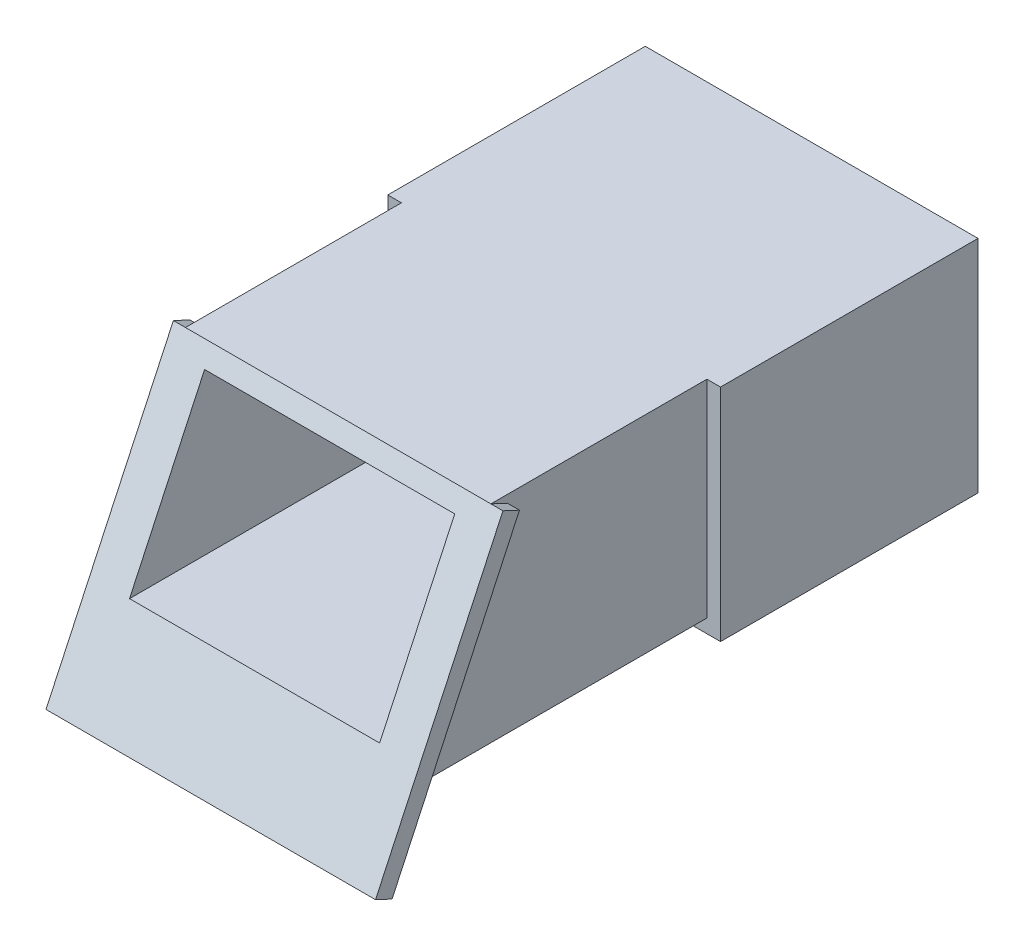
ISO-10303-21;
HEADER;
FILE_DESCRIPTION(('STEP AP214'),'2;1');
FILE_NAME('part.step','',(''),(''),'','','');
FILE_SCHEMA(('AUTOMOTIVE_DESIGN { 1 0 10303 214 1 1 1 1 }'));
ENDSEC;
DATA;
#1=APPLICATION_CONTEXT('core data for automotive mechanical design processes');
#2=APPLICATION_PROTOCOL_DEFINITION('international standard','automotive_design',2000,#1);
#3=PRODUCT_CONTEXT('',#1,'mechanical');
#4=PRODUCT('Part','Part','',(#3));
#5=PRODUCT_RELATED_PRODUCT_CATEGORY('part','',(#4));
#6=PRODUCT_DEFINITION_FORMATION('','',#4);
#7=PRODUCT_DEFINITION_CONTEXT('part definition',#1,'design');
#8=PRODUCT_DEFINITION('design','',#6,#7);
#9=PRODUCT_DEFINITION_SHAPE('','',#8);
#10=(LENGTH_UNIT() NAMED_UNIT(*) SI_UNIT(.MILLI.,.METRE.));
#11=(NAMED_UNIT(*) PLANE_ANGLE_UNIT() SI_UNIT($,.RADIAN.));
#12=(NAMED_UNIT(*) SI_UNIT($,.STERADIAN.) SOLID_ANGLE_UNIT());
#13=UNCERTAINTY_MEASURE_WITH_UNIT(LENGTH_MEASURE(1.E-05),#10,'distance_accuracy_value','');
#14=(GEOMETRIC_REPRESENTATION_CONTEXT(3) GLOBAL_UNCERTAINTY_ASSIGNED_CONTEXT((#13)) GLOBAL_UNIT_ASSIGNED_CONTEXT((#10,
#11,#12)) REPRESENTATION_CONTEXT('',''));
#15=CARTESIAN_POINT('',(0.,0.,0.));
#16=DIRECTION('',(0.,0.,1.));
#17=DIRECTION('',(1.,0.,0.));
#18=AXIS2_PLACEMENT_3D('',#15,#16,#17);
#19=CARTESIAN_POINT('',(0.,32.2321446955881,69.0956443006175));
#20=DIRECTION('',(0.,0.422750947184347,0.906245902972663));
#21=DIRECTION('',(0.,-0.906245902972663,0.422750947184347));
#22=AXIS2_PLACEMENT_3D('',#19,#20,#21);
#23=PLANE('',#22);
#24=DIRECTION('',(1.,0.,0.));
#25=VECTOR('',#24,1.);
#26=CARTESIAN_POINT('',(-36.8768135180335,17.9473146346855,75.7593162894288));
#27=LINE('',#26,#25);
#28=CARTESIAN_POINT('',(13.9281864819665,17.9473146346855,75.7593162894288));
#29=VERTEX_POINT('',#28);
#30=CARTESIAN_POINT('',(15.8531864819665,17.9473146346855,75.7593162894288));
#31=VERTEX_POINT('',#30);
#32=EDGE_CURVE('E226',#29,#31,#27,.T.);
#33=ORIENTED_EDGE('',*,*,#32,.F.);
#34=DIRECTION('',(-1.,0.,0.));
#35=VECTOR('',#34,1.);
#36=CARTESIAN_POINT('',(-37.1318135180335,17.9473146346855,75.7593162894288));
#37=LINE('',#36,#35);
#38=CARTESIAN_POINT('',(-34.9518135180335,17.9473146346855,75.7593162894288));
#39=VERTEX_POINT('',#38);
#40=EDGE_CURVE('E270',#29,#39,#37,.T.);
#41=ORIENTED_EDGE('',*,*,#40,.T.);
#42=CARTESIAN_POINT('',(-36.8768135180335,17.9473146346855,75.7593162894288));
#43=VERTEX_POINT('',#42);
#44=EDGE_CURVE('E244',#43,#39,#27,.T.);
#45=ORIENTED_EDGE('',*,*,#44,.F.);
#46=DIRECTION('',(0.,0.906245902972663,-0.422750947184347));
#47=VECTOR('',#46,1.);
#48=CARTESIAN_POINT('',(-36.8768135180335,17.9473146346855,75.7593162894288));
#49=LINE('',#48,#47);
#50=CARTESIAN_POINT('',(-36.8768135180335,-25.7518628066563,96.144366962658));
#51=VERTEX_POINT('',#50);
#52=EDGE_CURVE('E223',#51,#43,#49,.T.);
#53=ORIENTED_EDGE('',*,*,#52,.F.);
#54=DIRECTION('',(-1.,0.,0.));
#55=VECTOR('',#54,1.);
#56=CARTESIAN_POINT('',(-36.8768135180335,-25.7518628066563,96.144366962658));
#57=LINE('',#56,#55);
#58=CARTESIAN_POINT('',(15.8531864819665,-25.7518628066563,96.144366962658));
#59=VERTEX_POINT('',#58);
#60=EDGE_CURVE('E235',#59,#51,#57,.T.);
#61=ORIENTED_EDGE('',*,*,#60,.F.);
#62=DIRECTION('',(0.,-0.906245902972663,0.422750947184347));
#63=VECTOR('',#62,1.);
#64=CARTESIAN_POINT('',(15.8531864819665,17.9473146346855,75.7593162894288));
#65=LINE('',#64,#63);
#66=EDGE_CURVE('E246',#31,#59,#65,.T.);
#67=ORIENTED_EDGE('',*,*,#66,.F.);
#68=EDGE_LOOP('',(#33,#41,#45,#53,#61,#67));
#69=FACE_BOUND('',#68,.T.);
#70=DIRECTION('',(1.,0.,0.));
#71=VECTOR('',#70,1.);
#72=CARTESIAN_POINT('',(0.,15.0273146346855,77.1214551545306));
#73=LINE('',#72,#71);
#74=CARTESIAN_POINT('',(-30.5218135180335,15.0273146346855,77.1214551545306));
#75=VERTEX_POINT('',#74);
#76=CARTESIAN_POINT('',(9.49818648196652,15.0273146346855,77.1214551545306));
#77=VERTEX_POINT('',#76);
#78=EDGE_CURVE('E222',#75,#77,#73,.T.);
#79=ORIENTED_EDGE('',*,*,#78,.T.);
#80=DIRECTION('',(0.,-0.906245902972663,0.422750947184347));
#81=VECTOR('',#80,1.);
#82=CARTESIAN_POINT('',(9.49818648196652,32.2321446955881,69.0956443006175));
#83=LINE('',#82,#81);
#84=CARTESIAN_POINT('',(9.49818648196652,-10.7226853653145,89.1334674067121));
#85=VERTEX_POINT('',#84);
#86=EDGE_CURVE('E207',#77,#85,#83,.T.);
#87=ORIENTED_EDGE('',*,*,#86,.T.);
#88=DIRECTION('',(-1.,0.,0.));
#89=VECTOR('',#88,1.);
#90=CARTESIAN_POINT('',(0.,-10.7226853653145,89.1334674067121));
#91=LINE('',#90,#89);
#92=CARTESIAN_POINT('',(-30.5218135180335,-10.7226853653145,89.1334674067121));
#93=VERTEX_POINT('',#92);
#94=EDGE_CURVE('E215',#85,#93,#91,.T.);
#95=ORIENTED_EDGE('',*,*,#94,.T.);
#96=DIRECTION('',(0.,0.906245902972663,-0.422750947184347));
#97=VECTOR('',#96,1.);
#98=CARTESIAN_POINT('',(-30.5218135180335,32.2321446955881,69.0956443006175));
#99=LINE('',#98,#97);
#100=EDGE_CURVE('E219',#93,#75,#99,.T.);
#101=ORIENTED_EDGE('',*,*,#100,.T.);
#102=EDGE_LOOP('',(#79,#87,#95,#101));
#103=FACE_BOUND('',#102,.T.);
#104=ADVANCED_FACE('F59',(#69,#103),#23,.T.);
#105=CARTESIAN_POINT('',(-33.9518135180335,15.0273146346855,41.2));
#106=DIRECTION('',(0.,-1.,0.));
#107=DIRECTION('',(0.,0.,-1.));
#108=AXIS2_PLACEMENT_3D('',#105,#106,#107);
#109=PLANE('',#108);
#110=DIRECTION('',(-1.,0.,0.));
#111=VECTOR('',#110,1.);
#112=CARTESIAN_POINT('',(-33.9518135180335,15.0273146346855,41.2));
#113=LINE('',#112,#111);
#114=CARTESIAN_POINT('',(12.9281864819665,15.0273146346855,41.2));
#115=VERTEX_POINT('',#114);
#116=CARTESIAN_POINT('',(9.49818648196652,15.0273146346855,41.2));
#117=VERTEX_POINT('',#116);
#118=EDGE_CURVE('E310',#115,#117,#113,.T.);
#119=ORIENTED_EDGE('',*,*,#118,.T.);
#120=DIRECTION('',(0.,0.,-1.));
#121=VECTOR('',#120,1.);
#122=CARTESIAN_POINT('',(9.49818648196652,15.0273146346855,91.2));
#123=LINE('',#122,#121);
#124=EDGE_CURVE('E212',#77,#117,#123,.T.);
#125=ORIENTED_EDGE('',*,*,#124,.F.);
#126=ORIENTED_EDGE('',*,*,#78,.F.);
#127=DIRECTION('',(0.,0.,-1.));
#128=VECTOR('',#127,1.);
#129=CARTESIAN_POINT('',(-30.5218135180335,15.0273146346855,91.2));
#130=LINE('',#129,#128);
#131=CARTESIAN_POINT('',(-30.5218135180335,15.0273146346855,41.2));
#132=VERTEX_POINT('',#131);
#133=EDGE_CURVE('E281',#75,#132,#130,.T.);
#134=ORIENTED_EDGE('',*,*,#133,.T.);
#135=CARTESIAN_POINT('',(-33.9518135180335,15.0273146346855,41.2));
#136=VERTEX_POINT('',#135);
#137=EDGE_CURVE('E309',#132,#136,#113,.T.);
#138=ORIENTED_EDGE('',*,*,#137,.T.);
#139=DIRECTION('',(0.,0.,-1.));
#140=VECTOR('',#139,1.);
#141=CARTESIAN_POINT('',(-33.9518135180335,15.0273146346855,41.2));
#142=LINE('',#141,#140);
#143=CARTESIAN_POINT('',(-33.9518135180335,15.0273146346855,0.));
#144=VERTEX_POINT('',#143);
#145=EDGE_CURVE('E313',#136,#144,#142,.T.);
#146=ORIENTED_EDGE('',*,*,#145,.T.);
#147=DIRECTION('',(-1.,0.,0.));
#148=VECTOR('',#147,1.);
#149=CARTESIAN_POINT('',(-33.9518135180335,15.0273146346855,0.));
#150=LINE('',#149,#148);
#151=CARTESIAN_POINT('',(12.9281864819665,15.0273146346855,0.));
#152=VERTEX_POINT('',#151);
#153=EDGE_CURVE('E303',#152,#144,#150,.T.);
#154=ORIENTED_EDGE('',*,*,#153,.F.);
#155=DIRECTION('',(0.,0.,-1.));
#156=VECTOR('',#155,1.);
#157=CARTESIAN_POINT('',(12.9281864819665,15.0273146346855,41.2));
#158=LINE('',#157,#156);
#159=EDGE_CURVE('E326',#115,#152,#158,.T.);
#160=ORIENTED_EDGE('',*,*,#159,.F.);
#161=EDGE_LOOP('',(#119,#125,#126,#134,#138,#146,#154,#160));
#162=FACE_BOUND('',#161,.T.);
#163=ADVANCED_FACE('F436',(#162),#109,.T.);
#164=CARTESIAN_POINT('',(13.9281864819665,-15.1526853653145,91.2));
#165=DIRECTION('',(-1.,0.,0.));
#166=DIRECTION('',(0.,0.,1.));
#167=AXIS2_PLACEMENT_3D('',#164,#165,#166);
#168=PLANE('',#167);
#169=DIRECTION('',(0.,0.422750947184347,0.906245902972663));
#170=VECTOR('',#169,1.);
#171=CARTESIAN_POINT('',(13.9281864819665,17.9473146346855,75.7593162894288));
#172=LINE('',#171,#170);
#173=CARTESIAN_POINT('',(13.9281864819665,16.7128818689072,73.1130782527486));
#174=VERTEX_POINT('',#173);
#175=EDGE_CURVE('E263',#174,#29,#172,.T.);
#176=ORIENTED_EDGE('',*,*,#175,.F.);
#177=DIRECTION('',(0.,0.906245902972663,-0.422750947184347));
#178=VECTOR('',#177,1.);
#179=CARTESIAN_POINT('',(13.9281864819665,-16.3871181310928,88.5537619633198));
#180=LINE('',#179,#178);
#181=CARTESIAN_POINT('',(13.9281864819665,-15.1526853653145,87.9779164679015));
#182=VERTEX_POINT('',#181);
#183=EDGE_CURVE('E268',#182,#174,#180,.T.);
#184=ORIENTED_EDGE('',*,*,#183,.F.);
#185=DIRECTION('',(0.,0.,-1.));
#186=VECTOR('',#185,1.);
#187=CARTESIAN_POINT('',(13.9281864819665,-15.1526853653145,91.2));
#188=LINE('',#187,#186);
#189=CARTESIAN_POINT('',(13.9281864819665,-15.1526853653145,41.2));
#190=VERTEX_POINT('',#189);
#191=EDGE_CURVE('E296',#182,#190,#188,.T.);
#192=ORIENTED_EDGE('',*,*,#191,.T.);
#193=DIRECTION('',(0.,1.,0.));
#194=VECTOR('',#193,1.);
#195=CARTESIAN_POINT('',(13.9281864819665,-15.1526853653145,41.2));
#196=LINE('',#195,#194);
#197=CARTESIAN_POINT('',(13.9281864819665,17.9473146346855,41.2));
#198=VERTEX_POINT('',#197);
#199=EDGE_CURVE('E285',#190,#198,#196,.T.);
#200=ORIENTED_EDGE('',*,*,#199,.T.);
#201=DIRECTION('',(0.,0.,-1.));
#202=VECTOR('',#201,1.);
#203=CARTESIAN_POINT('',(13.9281864819665,17.9473146346855,91.2));
#204=LINE('',#203,#202);
#205=EDGE_CURVE('E294',#29,#198,#204,.T.);
#206=ORIENTED_EDGE('',*,*,#205,.F.);
#207=EDGE_LOOP('',(#176,#184,#192,#200,#206));
#208=FACE_BOUND('',#207,.T.);
#209=ADVANCED_FACE('F389',(#208),#168,.F.);
#210=CARTESIAN_POINT('',(-34.9518135180335,-15.1526853653145,91.2));
#211=DIRECTION('',(-1.,0.,0.));
#212=DIRECTION('',(0.,0.,1.));
#213=AXIS2_PLACEMENT_3D('',#210,#211,#212);
#214=PLANE('',#213);
#215=DIRECTION('',(0.,0.906245902972663,-0.422750947184347));
#216=VECTOR('',#215,1.);
#217=CARTESIAN_POINT('',(-34.9518135180335,-16.3871181310928,88.5537619633198));
#218=LINE('',#217,#216);
#219=CARTESIAN_POINT('',(-34.9518135180335,-15.1526853653145,87.9779164679015));
#220=VERTEX_POINT('',#219);
#221=CARTESIAN_POINT('',(-34.9518135180335,16.7128818689072,73.1130782527486));
#222=VERTEX_POINT('',#221);
#223=EDGE_CURVE('E265',#220,#222,#218,.T.);
#224=ORIENTED_EDGE('',*,*,#223,.T.);
#225=DIRECTION('',(0.,0.422750947184347,0.906245902972663));
#226=VECTOR('',#225,1.);
#227=CARTESIAN_POINT('',(-34.9518135180335,17.9473146346855,75.7593162894288));
#228=LINE('',#227,#226);
#229=EDGE_CURVE('E260',#222,#39,#228,.T.);
#230=ORIENTED_EDGE('',*,*,#229,.T.);
#231=DIRECTION('',(0.,0.,-1.));
#232=VECTOR('',#231,1.);
#233=CARTESIAN_POINT('',(-34.9518135180335,17.9473146346855,91.2));
#234=LINE('',#233,#232);
#235=CARTESIAN_POINT('',(-34.9518135180335,17.9473146346855,41.2));
#236=VERTEX_POINT('',#235);
#237=EDGE_CURVE('E292',#39,#236,#234,.T.);
#238=ORIENTED_EDGE('',*,*,#237,.T.);
#239=DIRECTION('',(0.,1.,0.));
#240=VECTOR('',#239,1.);
#241=CARTESIAN_POINT('',(-34.9518135180335,-15.1526853653145,41.2));
#242=LINE('',#241,#240);
#243=CARTESIAN_POINT('',(-34.9518135180335,-15.1526853653145,41.2));
#244=VERTEX_POINT('',#243);
#245=EDGE_CURVE('E288',#244,#236,#242,.T.);
#246=ORIENTED_EDGE('',*,*,#245,.F.);
#247=DIRECTION('',(0.,0.,-1.));
#248=VECTOR('',#247,1.);
#249=CARTESIAN_POINT('',(-34.9518135180335,-15.1526853653145,91.2));
#250=LINE('',#249,#248);
#251=EDGE_CURVE('E82',#220,#244,#250,.T.);
#252=ORIENTED_EDGE('',*,*,#251,.F.);
#253=EDGE_LOOP('',(#224,#230,#238,#246,#252));
#254=FACE_BOUND('',#253,.T.);
#255=ADVANCED_FACE('F396',(#254),#214,.T.);
#256=CARTESIAN_POINT('',(-30.5218135180335,15.0273146346855,91.2));
#257=DIRECTION('',(1.,0.,0.));
#258=DIRECTION('',(0.,1.,0.));
#259=AXIS2_PLACEMENT_3D('',#256,#257,#258);
#260=PLANE('',#259);
#261=ORIENTED_EDGE('',*,*,#133,.F.);
#262=ORIENTED_EDGE('',*,*,#100,.F.);
#263=DIRECTION('',(0.,0.,-1.));
#264=VECTOR('',#263,1.);
#265=CARTESIAN_POINT('',(-30.5218135180335,-10.7226853653145,91.2));
#266=LINE('',#265,#264);
#267=CARTESIAN_POINT('',(-30.5218135180335,-10.7226853653145,41.2));
#268=VERTEX_POINT('',#267);
#269=EDGE_CURVE('E74',#93,#268,#266,.T.);
#270=ORIENTED_EDGE('',*,*,#269,.T.);
#271=DIRECTION('',(0.,-1.,0.));
#272=VECTOR('',#271,1.);
#273=CARTESIAN_POINT('',(-30.5218135180335,15.0273146346855,41.2));
#274=LINE('',#273,#272);
#275=EDGE_CURVE('E273',#132,#268,#274,.T.);
#276=ORIENTED_EDGE('',*,*,#275,.F.);
#277=EDGE_LOOP('',(#261,#262,#270,#276));
#278=FACE_BOUND('',#277,.T.);
#279=ADVANCED_FACE('F450',(#278),#260,.T.);
#280=CARTESIAN_POINT('',(9.49818648196652,-10.7226853653145,91.2));
#281=DIRECTION('',(0.,-1.,0.));
#282=DIRECTION('',(1.,0.,0.));
#283=AXIS2_PLACEMENT_3D('',#280,#281,#282);
#284=PLANE('',#283);
#285=ORIENTED_EDGE('',*,*,#269,.F.);
#286=ORIENTED_EDGE('',*,*,#94,.F.);
#287=DIRECTION('',(0.,0.,-1.));
#288=VECTOR('',#287,1.);
#289=CARTESIAN_POINT('',(9.49818648196652,-10.7226853653145,91.2));
#290=LINE('',#289,#288);
#291=CARTESIAN_POINT('',(9.49818648196652,-10.7226853653145,41.2));
#292=VERTEX_POINT('',#291);
#293=EDGE_CURVE('E204',#85,#292,#290,.T.);
#294=ORIENTED_EDGE('',*,*,#293,.T.);
#295=DIRECTION('',(-1.,0.,0.));
#296=VECTOR('',#295,1.);
#297=CARTESIAN_POINT('',(9.49818648196652,-10.7226853653145,41.2));
#298=LINE('',#297,#296);
#299=EDGE_CURVE('E276',#292,#268,#298,.T.);
#300=ORIENTED_EDGE('',*,*,#299,.T.);
#301=EDGE_LOOP('',(#285,#286,#294,#300));
#302=FACE_BOUND('',#301,.T.);
#303=ADVANCED_FACE('F216',(#302),#284,.F.);
#304=CARTESIAN_POINT('',(9.49818648196652,15.0273146346855,91.2));
#305=DIRECTION('',(1.,0.,0.));
#306=DIRECTION('',(0.,1.,0.));
#307=AXIS2_PLACEMENT_3D('',#304,#305,#306);
#308=PLANE('',#307);
#309=ORIENTED_EDGE('',*,*,#293,.F.);
#310=ORIENTED_EDGE('',*,*,#86,.F.);
#311=ORIENTED_EDGE('',*,*,#124,.T.);
#312=DIRECTION('',(0.,-1.,0.));
#313=VECTOR('',#312,1.);
#314=CARTESIAN_POINT('',(9.49818648196652,15.0273146346855,41.2));
#315=LINE('',#314,#313);
#316=EDGE_CURVE('E210',#117,#292,#315,.T.);
#317=ORIENTED_EDGE('',*,*,#316,.T.);
#318=EDGE_LOOP('',(#309,#310,#311,#317));
#319=FACE_BOUND('',#318,.T.);
#320=ADVANCED_FACE('F205',(#319),#308,.F.);
#321=CARTESIAN_POINT('',(-34.9518135180335,-15.1526853653145,91.2));
#322=DIRECTION('',(0.,1.,0.));
#323=DIRECTION('',(0.,0.,1.));
#324=AXIS2_PLACEMENT_3D('',#321,#322,#323);
#325=PLANE('',#324);
#326=DIRECTION('',(1.,0.,0.));
#327=VECTOR('',#326,1.);
#328=CARTESIAN_POINT('',(-34.9518135180335,-15.1526853653145,87.9779164679015));
#329=LINE('',#328,#327);
#330=EDGE_CURVE('E12',#220,#182,#329,.T.);
#331=ORIENTED_EDGE('',*,*,#330,.F.);
#332=ORIENTED_EDGE('',*,*,#251,.T.);
#333=DIRECTION('',(1.,0.,0.));
#334=VECTOR('',#333,1.);
#335=CARTESIAN_POINT('',(-34.9518135180335,-15.1526853653145,41.2));
#336=LINE('',#335,#334);
#337=EDGE_CURVE('E283',#244,#190,#336,.T.);
#338=ORIENTED_EDGE('',*,*,#337,.T.);
#339=ORIENTED_EDGE('',*,*,#191,.F.);
#340=EDGE_LOOP('',(#331,#332,#338,#339));
#341=FACE_BOUND('',#340,.T.);
#342=ADVANCED_FACE('F392',(#341),#325,.F.);
#343=CARTESIAN_POINT('',(-37.1318135180335,17.9473146346855,41.2));
#344=DIRECTION('',(0.,-1.,0.));
#345=DIRECTION('',(0.,0.,-1.));
#346=AXIS2_PLACEMENT_3D('',#343,#344,#345);
#347=PLANE('',#346);
#348=ORIENTED_EDGE('',*,*,#40,.F.);
#349=ORIENTED_EDGE('',*,*,#205,.T.);
#350=DIRECTION('',(-1.,0.,0.));
#351=VECTOR('',#350,1.);
#352=CARTESIAN_POINT('',(-37.1318135180335,17.9473146346855,41.2));
#353=LINE('',#352,#351);
#354=CARTESIAN_POINT('',(16.1081864819665,17.9473146346855,41.2));
#355=VERTEX_POINT('',#354);
#356=EDGE_CURVE('E343',#355,#198,#353,.T.);
#357=ORIENTED_EDGE('',*,*,#356,.F.);
#358=DIRECTION('',(0.,0.,-1.));
#359=VECTOR('',#358,1.);
#360=CARTESIAN_POINT('',(16.1081864819665,17.9473146346855,41.2));
#361=LINE('',#360,#359);
#362=CARTESIAN_POINT('',(16.1081864819665,17.9473146346855,0.));
#363=VERTEX_POINT('',#362);
#364=EDGE_CURVE('E356',#355,#363,#361,.T.);
#365=ORIENTED_EDGE('',*,*,#364,.T.);
#366=DIRECTION('',(-1.,0.,0.));
#367=VECTOR('',#366,1.);
#368=CARTESIAN_POINT('',(-37.1318135180335,17.9473146346855,0.));
#369=LINE('',#368,#367);
#370=CARTESIAN_POINT('',(-37.1318135180335,17.9473146346855,0.));
#371=VERTEX_POINT('',#370);
#372=EDGE_CURVE('E338',#363,#371,#369,.T.);
#373=ORIENTED_EDGE('',*,*,#372,.T.);
#374=DIRECTION('',(0.,0.,-1.));
#375=VECTOR('',#374,1.);
#376=CARTESIAN_POINT('',(-37.1318135180335,17.9473146346855,41.2));
#377=LINE('',#376,#375);
#378=CARTESIAN_POINT('',(-37.1318135180335,17.9473146346855,41.2));
#379=VERTEX_POINT('',#378);
#380=EDGE_CURVE('E346',#379,#371,#377,.T.);
#381=ORIENTED_EDGE('',*,*,#380,.F.);
#382=EDGE_CURVE('E342',#236,#379,#353,.T.);
#383=ORIENTED_EDGE('',*,*,#382,.F.);
#384=ORIENTED_EDGE('',*,*,#237,.F.);
#385=EDGE_LOOP('',(#348,#349,#357,#365,#373,#381,#383,#384));
#386=FACE_BOUND('',#385,.T.);
#387=ADVANCED_FACE('F382',(#386),#347,.F.);
#388=CARTESIAN_POINT('',(0.,0.,41.2));
#389=DIRECTION('',(0.,0.,1.));
#390=DIRECTION('',(1.,0.,0.));
#391=AXIS2_PLACEMENT_3D('',#388,#389,#390);
#392=PLANE('',#391);
#393=ORIENTED_EDGE('',*,*,#337,.F.);
#394=ORIENTED_EDGE('',*,*,#245,.T.);
#395=ORIENTED_EDGE('',*,*,#382,.T.);
#396=DIRECTION('',(0.,-1.,0.));
#397=VECTOR('',#396,1.);
#398=CARTESIAN_POINT('',(-37.1318135180335,17.9473146346855,41.2));
#399=LINE('',#398,#397);
#400=CARTESIAN_POINT('',(-37.1318135180335,-17.3326853653145,41.2));
#401=VERTEX_POINT('',#400);
#402=EDGE_CURVE('E334',#379,#401,#399,.T.);
#403=ORIENTED_EDGE('',*,*,#402,.T.);
#404=DIRECTION('',(1.,0.,0.));
#405=VECTOR('',#404,1.);
#406=CARTESIAN_POINT('',(-37.1318135180335,-17.3326853653145,41.2));
#407=LINE('',#406,#405);
#408=CARTESIAN_POINT('',(16.1081864819665,-17.3326853653145,41.2));
#409=VERTEX_POINT('',#408);
#410=EDGE_CURVE('E337',#401,#409,#407,.T.);
#411=ORIENTED_EDGE('',*,*,#410,.T.);
#412=DIRECTION('',(0.,1.,0.));
#413=VECTOR('',#412,1.);
#414=CARTESIAN_POINT('',(16.1081864819665,17.9473146346855,41.2));
#415=LINE('',#414,#413);
#416=EDGE_CURVE('E340',#409,#355,#415,.T.);
#417=ORIENTED_EDGE('',*,*,#416,.T.);
#418=ORIENTED_EDGE('',*,*,#356,.T.);
#419=ORIENTED_EDGE('',*,*,#199,.F.);
#420=EDGE_LOOP('',(#393,#394,#395,#403,#411,#417,#418,#419));
#421=FACE_BOUND('',#420,.T.);
#422=ADVANCED_FACE('F386',(#421),#392,.T.);
#423=CARTESIAN_POINT('',(0.,0.,0.));
#424=DIRECTION('',(0.,0.,1.));
#425=DIRECTION('',(1.,0.,0.));
#426=AXIS2_PLACEMENT_3D('',#423,#424,#425);
#427=PLANE('',#426);
#428=DIRECTION('',(0.,-1.,0.));
#429=VECTOR('',#428,1.);
#430=CARTESIAN_POINT('',(-37.1318135180335,17.9473146346855,0.));
#431=LINE('',#430,#429);
#432=CARTESIAN_POINT('',(-37.1318135180335,-17.3326853653145,0.));
#433=VERTEX_POINT('',#432);
#434=EDGE_CURVE('E333',#371,#433,#431,.T.);
#435=ORIENTED_EDGE('',*,*,#434,.F.);
#436=ORIENTED_EDGE('',*,*,#372,.F.);
#437=DIRECTION('',(0.,1.,0.));
#438=VECTOR('',#437,1.);
#439=CARTESIAN_POINT('',(16.1081864819665,17.9473146346855,0.));
#440=LINE('',#439,#438);
#441=CARTESIAN_POINT('',(16.1081864819665,-17.3326853653145,0.));
#442=VERTEX_POINT('',#441);
#443=EDGE_CURVE('E351',#442,#363,#440,.T.);
#444=ORIENTED_EDGE('',*,*,#443,.F.);
#445=DIRECTION('',(1.,0.,0.));
#446=VECTOR('',#445,1.);
#447=CARTESIAN_POINT('',(-37.1318135180335,-17.3326853653145,0.));
#448=LINE('',#447,#446);
#449=EDGE_CURVE('E349',#433,#442,#448,.T.);
#450=ORIENTED_EDGE('',*,*,#449,.F.);
#451=EDGE_LOOP('',(#435,#436,#444,#450));
#452=FACE_BOUND('',#451,.T.);
#453=DIRECTION('',(0.,-1.,0.));
#454=VECTOR('',#453,1.);
#455=CARTESIAN_POINT('',(-33.9518135180335,15.0273146346855,0.));
#456=LINE('',#455,#454);
#457=CARTESIAN_POINT('',(-33.9518135180335,-14.1526853653145,0.));
#458=VERTEX_POINT('',#457);
#459=EDGE_CURVE('E298',#144,#458,#456,.T.);
#460=ORIENTED_EDGE('',*,*,#459,.T.);
#461=DIRECTION('',(1.,0.,0.));
#462=VECTOR('',#461,1.);
#463=CARTESIAN_POINT('',(-33.9518135180335,-14.1526853653145,0.));
#464=LINE('',#463,#462);
#465=CARTESIAN_POINT('',(12.9281864819665,-14.1526853653145,0.));
#466=VERTEX_POINT('',#465);
#467=EDGE_CURVE('E316',#458,#466,#464,.T.);
#468=ORIENTED_EDGE('',*,*,#467,.T.);
#469=DIRECTION('',(0.,1.,0.));
#470=VECTOR('',#469,1.);
#471=CARTESIAN_POINT('',(12.9281864819665,15.0273146346855,0.));
#472=LINE('',#471,#470);
#473=EDGE_CURVE('E319',#466,#152,#472,.T.);
#474=ORIENTED_EDGE('',*,*,#473,.T.);
#475=ORIENTED_EDGE('',*,*,#153,.T.);
#476=EDGE_LOOP('',(#460,#468,#474,#475));
#477=FACE_BOUND('',#476,.T.);
#478=ADVANCED_FACE('F372',(#452,#477),#427,.F.);
#479=CARTESIAN_POINT('',(-37.1318135180335,17.9473146346855,41.2));
#480=DIRECTION('',(1.,0.,0.));
#481=DIRECTION('',(0.,1.,0.));
#482=AXIS2_PLACEMENT_3D('',#479,#480,#481);
#483=PLANE('',#482);
#484=ORIENTED_EDGE('',*,*,#434,.T.);
#485=DIRECTION('',(0.,0.,-1.));
#486=VECTOR('',#485,1.);
#487=CARTESIAN_POINT('',(-37.1318135180335,-17.3326853653145,41.2));
#488=LINE('',#487,#486);
#489=EDGE_CURVE('E67',#401,#433,#488,.T.);
#490=ORIENTED_EDGE('',*,*,#489,.F.);
#491=ORIENTED_EDGE('',*,*,#402,.F.);
#492=ORIENTED_EDGE('',*,*,#380,.T.);
#493=EDGE_LOOP('',(#484,#490,#491,#492));
#494=FACE_BOUND('',#493,.T.);
#495=ADVANCED_FACE('F61',(#494),#483,.F.);
#496=CARTESIAN_POINT('',(-37.1318135180335,-17.3326853653145,41.2));
#497=DIRECTION('',(0.,1.,0.));
#498=DIRECTION('',(0.,0.,1.));
#499=AXIS2_PLACEMENT_3D('',#496,#497,#498);
#500=PLANE('',#499);
#501=ORIENTED_EDGE('',*,*,#449,.T.);
#502=DIRECTION('',(0.,0.,-1.));
#503=VECTOR('',#502,1.);
#504=CARTESIAN_POINT('',(16.1081864819665,-17.3326853653145,41.2));
#505=LINE('',#504,#503);
#506=EDGE_CURVE('E359',#409,#442,#505,.T.);
#507=ORIENTED_EDGE('',*,*,#506,.F.);
#508=ORIENTED_EDGE('',*,*,#410,.F.);
#509=ORIENTED_EDGE('',*,*,#489,.T.);
#510=EDGE_LOOP('',(#501,#507,#508,#509));
#511=FACE_BOUND('',#510,.T.);
#512=ADVANCED_FACE('F364',(#511),#500,.F.);
#513=CARTESIAN_POINT('',(16.1081864819665,17.9473146346855,41.2));
#514=DIRECTION('',(-1.,0.,0.));
#515=DIRECTION('',(0.,-1.,0.));
#516=AXIS2_PLACEMENT_3D('',#513,#514,#515);
#517=PLANE('',#516);
#518=ORIENTED_EDGE('',*,*,#443,.T.);
#519=ORIENTED_EDGE('',*,*,#364,.F.);
#520=ORIENTED_EDGE('',*,*,#416,.F.);
#521=ORIENTED_EDGE('',*,*,#506,.T.);
#522=EDGE_LOOP('',(#518,#519,#520,#521));
#523=FACE_BOUND('',#522,.T.);
#524=ADVANCED_FACE('F377',(#523),#517,.F.);
#525=CARTESIAN_POINT('',(-33.9518135180335,15.0273146346855,41.2));
#526=DIRECTION('',(1.,0.,0.));
#527=DIRECTION('',(0.,1.,0.));
#528=AXIS2_PLACEMENT_3D('',#525,#526,#527);
#529=PLANE('',#528);
#530=ORIENTED_EDGE('',*,*,#459,.F.);
#531=ORIENTED_EDGE('',*,*,#145,.F.);
#532=DIRECTION('',(0.,-1.,0.));
#533=VECTOR('',#532,1.);
#534=CARTESIAN_POINT('',(-33.9518135180335,15.0273146346855,41.2));
#535=LINE('',#534,#533);
#536=CARTESIAN_POINT('',(-33.9518135180335,-14.1526853653145,41.2));
#537=VERTEX_POINT('',#536);
#538=EDGE_CURVE('E299',#136,#537,#535,.T.);
#539=ORIENTED_EDGE('',*,*,#538,.T.);
#540=DIRECTION('',(0.,0.,-1.));
#541=VECTOR('',#540,1.);
#542=CARTESIAN_POINT('',(-33.9518135180335,-14.1526853653145,41.2));
#543=LINE('',#542,#541);
#544=EDGE_CURVE('E330',#537,#458,#543,.T.);
#545=ORIENTED_EDGE('',*,*,#544,.T.);
#546=EDGE_LOOP('',(#530,#531,#539,#545));
#547=FACE_BOUND('',#546,.T.);
#548=ADVANCED_FACE('F466',(#547),#529,.T.);
#549=CARTESIAN_POINT('',(-33.9518135180335,-14.1526853653145,41.2));
#550=DIRECTION('',(0.,1.,0.));
#551=DIRECTION('',(0.,0.,1.));
#552=AXIS2_PLACEMENT_3D('',#549,#550,#551);
#553=PLANE('',#552);
#554=ORIENTED_EDGE('',*,*,#467,.F.);
#555=ORIENTED_EDGE('',*,*,#544,.F.);
#556=DIRECTION('',(1.,0.,0.));
#557=VECTOR('',#556,1.);
#558=CARTESIAN_POINT('',(-33.9518135180335,-14.1526853653145,41.2));
#559=LINE('',#558,#557);
#560=CARTESIAN_POINT('',(12.9281864819665,-14.1526853653145,41.2));
#561=VERTEX_POINT('',#560);
#562=EDGE_CURVE('E302',#537,#561,#559,.T.);
#563=ORIENTED_EDGE('',*,*,#562,.T.);
#564=DIRECTION('',(0.,0.,-1.));
#565=VECTOR('',#564,1.);
#566=CARTESIAN_POINT('',(12.9281864819665,-14.1526853653145,41.2));
#567=LINE('',#566,#565);
#568=EDGE_CURVE('E328',#561,#466,#567,.T.);
#569=ORIENTED_EDGE('',*,*,#568,.T.);
#570=EDGE_LOOP('',(#554,#555,#563,#569));
#571=FACE_BOUND('',#570,.T.);
#572=ADVANCED_FACE('F462',(#571),#553,.T.);
#573=CARTESIAN_POINT('',(12.9281864819665,15.0273146346855,41.2));
#574=DIRECTION('',(-1.,0.,0.));
#575=DIRECTION('',(0.,-1.,0.));
#576=AXIS2_PLACEMENT_3D('',#573,#574,#575);
#577=PLANE('',#576);
#578=ORIENTED_EDGE('',*,*,#473,.F.);
#579=ORIENTED_EDGE('',*,*,#568,.F.);
#580=DIRECTION('',(0.,1.,0.));
#581=VECTOR('',#580,1.);
#582=CARTESIAN_POINT('',(12.9281864819665,15.0273146346855,41.2));
#583=LINE('',#582,#581);
#584=EDGE_CURVE('E306',#561,#115,#583,.T.);
#585=ORIENTED_EDGE('',*,*,#584,.T.);
#586=ORIENTED_EDGE('',*,*,#159,.T.);
#587=EDGE_LOOP('',(#578,#579,#585,#586));
#588=FACE_BOUND('',#587,.T.);
#589=ADVANCED_FACE('F431',(#588),#577,.T.);
#590=CARTESIAN_POINT('',(0.,0.,41.2));
#591=DIRECTION('',(0.,0.,1.));
#592=DIRECTION('',(1.,0.,0.));
#593=AXIS2_PLACEMENT_3D('',#590,#591,#592);
#594=PLANE('',#593);
#595=ORIENTED_EDGE('',*,*,#137,.F.);
#596=ORIENTED_EDGE('',*,*,#275,.T.);
#597=ORIENTED_EDGE('',*,*,#299,.F.);
#598=ORIENTED_EDGE('',*,*,#316,.F.);
#599=ORIENTED_EDGE('',*,*,#118,.F.);
#600=ORIENTED_EDGE('',*,*,#584,.F.);
#601=ORIENTED_EDGE('',*,*,#562,.F.);
#602=ORIENTED_EDGE('',*,*,#538,.F.);
#603=EDGE_LOOP('',(#595,#596,#597,#598,#599,#600,#601,#602));
#604=FACE_BOUND('',#603,.T.);
#605=ADVANCED_FACE('F424',(#604),#594,.F.);
#606=CARTESIAN_POINT('',(-36.8768135180335,-26.9862955724346,93.4981289259778));
#607=DIRECTION('',(0.,0.906245902972663,-0.422750947184347));
#608=DIRECTION('',(0.,0.422750947184347,0.906245902972663));
#609=AXIS2_PLACEMENT_3D('',#606,#607,#608);
#610=PLANE('',#609);
#611=ORIENTED_EDGE('',*,*,#60,.T.);
#612=DIRECTION('',(0.,0.422750947184347,0.906245902972663));
#613=VECTOR('',#612,1.);
#614=CARTESIAN_POINT('',(-36.8768135180335,-26.9862955724346,93.4981289259778));
#615=LINE('',#614,#613);
#616=CARTESIAN_POINT('',(-36.8768135180335,-26.9862955724346,93.4981289259778));
#617=VERTEX_POINT('',#616);
#618=EDGE_CURVE('E242',#617,#51,#615,.T.);
#619=ORIENTED_EDGE('',*,*,#618,.F.);
#620=DIRECTION('',(-1.,0.,0.));
#621=VECTOR('',#620,1.);
#622=CARTESIAN_POINT('',(-36.8768135180335,-26.9862955724346,93.4981289259778));
#623=LINE('',#622,#621);
#624=CARTESIAN_POINT('',(15.8531864819665,-26.9862955724346,93.4981289259778));
#625=VERTEX_POINT('',#624);
#626=EDGE_CURVE('E241',#625,#617,#623,.T.);
#627=ORIENTED_EDGE('',*,*,#626,.F.);
#628=DIRECTION('',(0.,0.422750947184347,0.906245902972663));
#629=VECTOR('',#628,1.);
#630=CARTESIAN_POINT('',(15.8531864819665,-26.9862955724346,93.4981289259778));
#631=LINE('',#630,#629);
#632=EDGE_CURVE('E251',#625,#59,#631,.T.);
#633=ORIENTED_EDGE('',*,*,#632,.T.);
#634=EDGE_LOOP('',(#611,#619,#627,#633));
#635=FACE_BOUND('',#634,.T.);
#636=ADVANCED_FACE('F422',(#635),#610,.F.);
#637=CARTESIAN_POINT('',(15.8531864819665,16.7128818689072,73.1130782527486));
#638=DIRECTION('',(-1.,0.,0.));
#639=DIRECTION('',(0.,-1.,0.));
#640=AXIS2_PLACEMENT_3D('',#637,#638,#639);
#641=PLANE('',#640);
#642=ORIENTED_EDGE('',*,*,#66,.T.);
#643=ORIENTED_EDGE('',*,*,#632,.F.);
#644=DIRECTION('',(0.,-0.906245902972663,0.422750947184347));
#645=VECTOR('',#644,1.);
#646=CARTESIAN_POINT('',(15.8531864819665,16.7128818689072,73.1130782527486));
#647=LINE('',#646,#645);
#648=CARTESIAN_POINT('',(15.8531864819665,16.7128818689072,73.1130782527486));
#649=VERTEX_POINT('',#648);
#650=EDGE_CURVE('E239',#649,#625,#647,.T.);
#651=ORIENTED_EDGE('',*,*,#650,.F.);
#652=DIRECTION('',(0.,0.422750947184347,0.906245902972663));
#653=VECTOR('',#652,1.);
#654=CARTESIAN_POINT('',(15.8531864819665,16.7128818689072,73.1130782527486));
#655=LINE('',#654,#653);
#656=EDGE_CURVE('E254',#649,#31,#655,.T.);
#657=ORIENTED_EDGE('',*,*,#656,.T.);
#658=EDGE_LOOP('',(#642,#643,#651,#657));
#659=FACE_BOUND('',#658,.T.);
#660=ADVANCED_FACE('F409',(#659),#641,.F.);
#661=CARTESIAN_POINT('',(-36.8768135180335,16.7128818689072,73.1130782527486));
#662=DIRECTION('',(0.,-0.906245902972663,0.422750947184347));
#663=DIRECTION('',(0.,-0.422750947184347,-0.906245902972663));
#664=AXIS2_PLACEMENT_3D('',#661,#662,#663);
#665=PLANE('',#664);
#666=ORIENTED_EDGE('',*,*,#229,.F.);
#667=DIRECTION('',(1.,0.,0.));
#668=VECTOR('',#667,1.);
#669=CARTESIAN_POINT('',(-36.8768135180335,16.7128818689072,73.1130782527486));
#670=LINE('',#669,#668);
#671=CARTESIAN_POINT('',(-36.8768135180335,16.7128818689072,73.1130782527486));
#672=VERTEX_POINT('',#671);
#673=EDGE_CURVE('E236',#672,#222,#670,.T.);
#674=ORIENTED_EDGE('',*,*,#673,.F.);
#675=DIRECTION('',(0.,0.422750947184347,0.906245902972663));
#676=VECTOR('',#675,1.);
#677=CARTESIAN_POINT('',(-36.8768135180335,16.7128818689072,73.1130782527486));
#678=LINE('',#677,#676);
#679=EDGE_CURVE('E257',#672,#43,#678,.T.);
#680=ORIENTED_EDGE('',*,*,#679,.T.);
#681=ORIENTED_EDGE('',*,*,#44,.T.);
#682=EDGE_LOOP('',(#666,#674,#680,#681));
#683=FACE_BOUND('',#682,.T.);
#684=ADVANCED_FACE('F418',(#683),#665,.F.);
#685=CARTESIAN_POINT('',(-36.8768135180335,16.7128818689072,73.1130782527486));
#686=DIRECTION('',(1.,0.,0.));
#687=DIRECTION('',(0.,0.,-1.));
#688=AXIS2_PLACEMENT_3D('',#685,#686,#687);
#689=PLANE('',#688);
#690=ORIENTED_EDGE('',*,*,#52,.T.);
#691=ORIENTED_EDGE('',*,*,#679,.F.);
#692=DIRECTION('',(0.,0.906245902972663,-0.422750947184347));
#693=VECTOR('',#692,1.);
#694=CARTESIAN_POINT('',(-36.8768135180335,16.7128818689072,73.1130782527486));
#695=LINE('',#694,#693);
#696=EDGE_CURVE('E231',#617,#672,#695,.T.);
#697=ORIENTED_EDGE('',*,*,#696,.F.);
#698=ORIENTED_EDGE('',*,*,#618,.T.);
#699=EDGE_LOOP('',(#690,#691,#697,#698));
#700=FACE_BOUND('',#699,.T.);
#701=ADVANCED_FACE('F420',(#700),#689,.F.);
#702=EDGE_CURVE('E234',#174,#649,#670,.T.);
#703=ORIENTED_EDGE('',*,*,#702,.F.);
#704=ORIENTED_EDGE('',*,*,#175,.T.);
#705=ORIENTED_EDGE('',*,*,#32,.T.);
#706=ORIENTED_EDGE('',*,*,#656,.F.);
#707=EDGE_LOOP('',(#703,#704,#705,#706));
#708=FACE_BOUND('',#707,.T.);
#709=ADVANCED_FACE('F406',(#708),#665,.F.);
#710=CARTESIAN_POINT('',(0.,30.9977119298098,66.4494062639373));
#711=DIRECTION('',(0.,0.422750947184347,0.906245902972663));
#712=DIRECTION('',(0.,-0.906245902972663,0.422750947184347));
#713=AXIS2_PLACEMENT_3D('',#710,#711,#712);
#714=PLANE('',#713);
#715=ORIENTED_EDGE('',*,*,#330,.T.);
#716=ORIENTED_EDGE('',*,*,#183,.T.);
#717=ORIENTED_EDGE('',*,*,#702,.T.);
#718=ORIENTED_EDGE('',*,*,#650,.T.);
#719=ORIENTED_EDGE('',*,*,#626,.T.);
#720=ORIENTED_EDGE('',*,*,#696,.T.);
#721=ORIENTED_EDGE('',*,*,#673,.T.);
#722=ORIENTED_EDGE('',*,*,#223,.F.);
#723=EDGE_LOOP('',(#715,#716,#717,#718,#719,#720,#721,#722));
#724=FACE_BOUND('',#723,.T.);
#725=ADVANCED_FACE('F413',(#724),#714,.F.);
#726=CLOSED_SHELL('',(#104,#163,#209,#255,#279,#303,#320,#342,#387,#422,#478,#495,#512,#524,
#548,#572,#589,#605,#636,#660,#684,#701,#709,#725));
#727=MANIFOLD_SOLID_BREP('B2',#726);
#728=ADVANCED_BREP_SHAPE_REPRESENTATION('',(#18,#727),#14);
#729=SHAPE_DEFINITION_REPRESENTATION(#9,#728);
ENDSEC;
END-ISO-10303-21;
